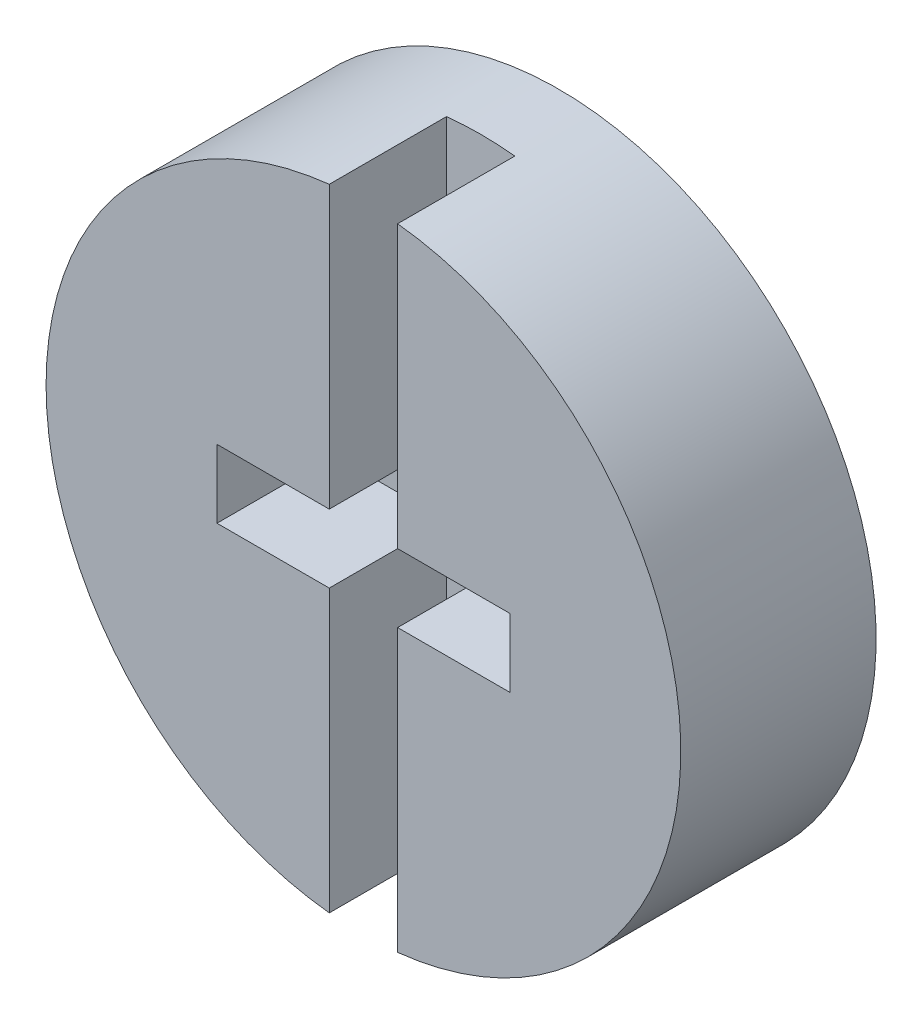
ISO-10303-21;
HEADER;
FILE_DESCRIPTION(('STEP AP214'),'2;1');
FILE_NAME('part.step','',(''),(''),'','','');
FILE_SCHEMA(('AUTOMOTIVE_DESIGN { 1 0 10303 214 1 1 1 1 }'));
ENDSEC;
DATA;
#1=APPLICATION_CONTEXT('core data for automotive mechanical design processes');
#2=APPLICATION_PROTOCOL_DEFINITION('international standard','automotive_design',2000,#1);
#3=PRODUCT_CONTEXT('',#1,'mechanical');
#4=PRODUCT('Part','Part','',(#3));
#5=PRODUCT_RELATED_PRODUCT_CATEGORY('part','',(#4));
#6=PRODUCT_DEFINITION_FORMATION('','',#4);
#7=PRODUCT_DEFINITION_CONTEXT('part definition',#1,'design');
#8=PRODUCT_DEFINITION('design','',#6,#7);
#9=PRODUCT_DEFINITION_SHAPE('','',#8);
#10=(LENGTH_UNIT() NAMED_UNIT(*) SI_UNIT(.MILLI.,.METRE.));
#11=(NAMED_UNIT(*) PLANE_ANGLE_UNIT() SI_UNIT($,.RADIAN.));
#12=(NAMED_UNIT(*) SI_UNIT($,.STERADIAN.) SOLID_ANGLE_UNIT());
#13=UNCERTAINTY_MEASURE_WITH_UNIT(LENGTH_MEASURE(1.E-05),#10,'distance_accuracy_value','');
#14=(GEOMETRIC_REPRESENTATION_CONTEXT(3) GLOBAL_UNCERTAINTY_ASSIGNED_CONTEXT((#13)) GLOBAL_UNIT_ASSIGNED_CONTEXT((#10,
#11,#12)) REPRESENTATION_CONTEXT('',''));
#15=CARTESIAN_POINT('',(0.,0.,0.));
#16=DIRECTION('',(0.,0.,1.));
#17=DIRECTION('',(1.,0.,0.));
#18=AXIS2_PLACEMENT_3D('',#15,#16,#17);
#19=CARTESIAN_POINT('',(6.83,76.6,-25.09841350948));
#20=DIRECTION('',(0.,0.,1.));
#21=DIRECTION('',(1.,0.,0.));
#22=AXIS2_PLACEMENT_3D('',#19,#20,#21);
#23=PLANE('',#22);
#24=DIRECTION('',(0.,1.,0.));
#25=VECTOR('',#24,1.);
#26=CARTESIAN_POINT('',(7.18,76.95,-25.09841350948));
#27=LINE('',#26,#25);
#28=CARTESIAN_POINT('',(7.18,76.95,-25.09841350948));
#29=VERTEX_POINT('',#28);
#30=CARTESIAN_POINT('',(7.18,79.8310988842809,-25.09841350948));
#31=VERTEX_POINT('',#30);
#32=EDGE_CURVE('E169',#29,#31,#27,.T.);
#33=ORIENTED_EDGE('',*,*,#32,.T.);
#34=CARTESIAN_POINT('',(6.83,76.6,-25.09841350948));
#35=DIRECTION('',(0.,0.,-1.));
#36=DIRECTION('',(-1.,0.,0.));
#37=AXIS2_PLACEMENT_3D('',#34,#35,#36);
#38=CIRCLE('',#37,3.25);
#39=CARTESIAN_POINT('',(6.48,79.8310988842809,-25.09841350948));
#40=VERTEX_POINT('',#39);
#41=EDGE_CURVE('E85',#31,#40,#38,.F.);
#42=ORIENTED_EDGE('',*,*,#41,.T.);
#43=DIRECTION('',(0.,1.,0.));
#44=VECTOR('',#43,1.);
#45=CARTESIAN_POINT('',(6.48,80.764650726676,-25.09841350948));
#46=LINE('',#45,#44);
#47=CARTESIAN_POINT('',(6.48,76.95,-25.09841350948));
#48=VERTEX_POINT('',#47);
#49=EDGE_CURVE('E91',#40,#48,#46,.F.);
#50=ORIENTED_EDGE('',*,*,#49,.T.);
#51=DIRECTION('',(1.,0.,0.));
#52=VECTOR('',#51,1.);
#53=CARTESIAN_POINT('',(6.48,76.95,-25.09841350948));
#54=LINE('',#53,#52);
#55=CARTESIAN_POINT('',(5.33,76.95,-25.09841350948));
#56=VERTEX_POINT('',#55);
#57=EDGE_CURVE('E71',#48,#56,#54,.F.);
#58=ORIENTED_EDGE('',*,*,#57,.T.);
#59=DIRECTION('',(0.,1.,0.));
#60=VECTOR('',#59,1.);
#61=CARTESIAN_POINT('',(5.33,76.95,-25.09841350948));
#62=LINE('',#61,#60);
#63=CARTESIAN_POINT('',(5.33,76.25,-25.09841350948));
#64=VERTEX_POINT('',#63);
#65=EDGE_CURVE('E196',#56,#64,#62,.F.);
#66=ORIENTED_EDGE('',*,*,#65,.T.);
#67=DIRECTION('',(1.,0.,0.));
#68=VECTOR('',#67,1.);
#69=CARTESIAN_POINT('',(5.33,76.25,-25.09841350948));
#70=LINE('',#69,#68);
#71=CARTESIAN_POINT('',(6.48,76.25,-25.09841350948));
#72=VERTEX_POINT('',#71);
#73=EDGE_CURVE('E172',#64,#72,#70,.T.);
#74=ORIENTED_EDGE('',*,*,#73,.T.);
#75=DIRECTION('',(0.,1.,0.));
#76=VECTOR('',#75,1.);
#77=CARTESIAN_POINT('',(6.48,76.25,-25.09841350948));
#78=LINE('',#77,#76);
#79=CARTESIAN_POINT('',(6.48,73.3689011157191,-25.09841350948));
#80=VERTEX_POINT('',#79);
#81=EDGE_CURVE('E95',#72,#80,#78,.F.);
#82=ORIENTED_EDGE('',*,*,#81,.T.);
#83=CARTESIAN_POINT('',(6.83,76.6,-25.09841350948));
#84=DIRECTION('',(0.,0.,-1.));
#85=DIRECTION('',(-1.,0.,0.));
#86=AXIS2_PLACEMENT_3D('',#83,#84,#85);
#87=CIRCLE('',#86,3.25);
#88=CARTESIAN_POINT('',(7.18,73.3689011157191,-25.09841350948));
#89=VERTEX_POINT('',#88);
#90=EDGE_CURVE('E20',#80,#89,#87,.F.);
#91=ORIENTED_EDGE('',*,*,#90,.T.);
#92=DIRECTION('',(0.,1.,0.));
#93=VECTOR('',#92,1.);
#94=CARTESIAN_POINT('',(7.18,73.083450539147,-25.09841350948));
#95=LINE('',#94,#93);
#96=CARTESIAN_POINT('',(7.18,76.25,-25.09841350948));
#97=VERTEX_POINT('',#96);
#98=EDGE_CURVE('E114',#89,#97,#95,.T.);
#99=ORIENTED_EDGE('',*,*,#98,.T.);
#100=DIRECTION('',(1.,0.,0.));
#101=VECTOR('',#100,1.);
#102=CARTESIAN_POINT('',(7.18,76.25,-25.09841350948));
#103=LINE('',#102,#101);
#104=CARTESIAN_POINT('',(8.33,76.25,-25.09841350948));
#105=VERTEX_POINT('',#104);
#106=EDGE_CURVE('E127',#97,#105,#103,.T.);
#107=ORIENTED_EDGE('',*,*,#106,.T.);
#108=DIRECTION('',(0.,1.,0.));
#109=VECTOR('',#108,1.);
#110=CARTESIAN_POINT('',(8.33,76.25,-25.09841350948));
#111=LINE('',#110,#109);
#112=CARTESIAN_POINT('',(8.33,76.95,-25.09841350948));
#113=VERTEX_POINT('',#112);
#114=EDGE_CURVE('E153',#105,#113,#111,.T.);
#115=ORIENTED_EDGE('',*,*,#114,.T.);
#116=DIRECTION('',(1.,0.,0.));
#117=VECTOR('',#116,1.);
#118=CARTESIAN_POINT('',(8.33,76.95,-25.09841350948));
#119=LINE('',#118,#117);
#120=EDGE_CURVE('E164',#113,#29,#119,.F.);
#121=ORIENTED_EDGE('',*,*,#120,.T.);
#122=EDGE_LOOP('',(#33,#42,#50,#58,#66,#74,#82,#91,#99,#107,#115,#121));
#123=FACE_BOUND('',#122,.T.);
#124=ADVANCED_FACE('F17',(#123),#23,.T.);
#125=CARTESIAN_POINT('',(6.48,76.95,-23.89841350948));
#126=DIRECTION('',(0.,1.,0.));
#127=DIRECTION('',(0.,0.,1.));
#128=AXIS2_PLACEMENT_3D('',#125,#126,#127);
#129=PLANE('',#128);
#130=ORIENTED_EDGE('',*,*,#57,.F.);
#131=DIRECTION('',(0.,0.,1.));
#132=VECTOR('',#131,1.);
#133=CARTESIAN_POINT('',(6.48,76.95,-23.89841350948));
#134=LINE('',#133,#132);
#135=CARTESIAN_POINT('',(6.48,76.95,-23.89841350948));
#136=VERTEX_POINT('',#135);
#137=EDGE_CURVE('E76',#48,#136,#134,.T.);
#138=ORIENTED_EDGE('',*,*,#137,.T.);
#139=DIRECTION('',(1.,0.,0.));
#140=VECTOR('',#139,1.);
#141=CARTESIAN_POINT('',(6.83,76.95,-23.89841350948));
#142=LINE('',#141,#140);
#143=CARTESIAN_POINT('',(5.33,76.95,-23.89841350948));
#144=VERTEX_POINT('',#143);
#145=EDGE_CURVE('E134',#144,#136,#142,.T.);
#146=ORIENTED_EDGE('',*,*,#145,.F.);
#147=DIRECTION('',(0.,0.,1.));
#148=VECTOR('',#147,1.);
#149=CARTESIAN_POINT('',(5.33,76.95,-23.89841350948));
#150=LINE('',#149,#148);
#151=EDGE_CURVE('E79',#144,#56,#150,.F.);
#152=ORIENTED_EDGE('',*,*,#151,.T.);
#153=EDGE_LOOP('',(#130,#138,#146,#152));
#154=FACE_BOUND('',#153,.T.);
#155=ADVANCED_FACE('F73',(#154),#129,.F.);
#156=CARTESIAN_POINT('',(6.48,80.764650726676,-23.89841350948));
#157=DIRECTION('',(-1.,0.,0.));
#158=DIRECTION('',(0.,0.,1.));
#159=AXIS2_PLACEMENT_3D('',#156,#157,#158);
#160=PLANE('',#159);
#161=ORIENTED_EDGE('',*,*,#49,.F.);
#162=DIRECTION('',(0.,0.,1.));
#163=VECTOR('',#162,1.);
#164=CARTESIAN_POINT('',(6.48,79.831098884281,-23.89841350948));
#165=LINE('',#164,#163);
#166=CARTESIAN_POINT('',(6.48,79.8310988842809,-23.89841350948));
#167=VERTEX_POINT('',#166);
#168=EDGE_CURVE('E84',#167,#40,#165,.F.);
#169=ORIENTED_EDGE('',*,*,#168,.F.);
#170=DIRECTION('',(0.,1.,0.));
#171=VECTOR('',#170,1.);
#172=CARTESIAN_POINT('',(6.48,76.6,-23.89841350948));
#173=LINE('',#172,#171);
#174=EDGE_CURVE('E94',#136,#167,#173,.T.);
#175=ORIENTED_EDGE('',*,*,#174,.F.);
#176=ORIENTED_EDGE('',*,*,#137,.F.);
#177=EDGE_LOOP('',(#161,#169,#175,#176));
#178=FACE_BOUND('',#177,.T.);
#179=ADVANCED_FACE('F89',(#178),#160,.F.);
#180=CARTESIAN_POINT('',(6.48,76.25,-23.89841350948));
#181=DIRECTION('',(-1.,0.,0.));
#182=DIRECTION('',(0.,0.,1.));
#183=AXIS2_PLACEMENT_3D('',#180,#181,#182);
#184=PLANE('',#183);
#185=ORIENTED_EDGE('',*,*,#81,.F.);
#186=DIRECTION('',(0.,0.,-1.));
#187=VECTOR('',#186,1.);
#188=CARTESIAN_POINT('',(6.48,76.25,-23.89841350948));
#189=LINE('',#188,#187);
#190=CARTESIAN_POINT('',(6.48,76.25,-23.89841350948));
#191=VERTEX_POINT('',#190);
#192=EDGE_CURVE('E173',#72,#191,#189,.F.);
#193=ORIENTED_EDGE('',*,*,#192,.T.);
#194=DIRECTION('',(0.,1.,0.));
#195=VECTOR('',#194,1.);
#196=CARTESIAN_POINT('',(6.48,76.6,-23.89841350948));
#197=LINE('',#196,#195);
#198=CARTESIAN_POINT('',(6.48,73.3689011157191,-23.89841350948));
#199=VERTEX_POINT('',#198);
#200=EDGE_CURVE('E182',#199,#191,#197,.T.);
#201=ORIENTED_EDGE('',*,*,#200,.F.);
#202=DIRECTION('',(0.,0.,1.));
#203=VECTOR('',#202,1.);
#204=CARTESIAN_POINT('',(6.48,73.368901115719,-23.89841350948));
#205=LINE('',#204,#203);
#206=EDGE_CURVE('E170',#80,#199,#205,.T.);
#207=ORIENTED_EDGE('',*,*,#206,.F.);
#208=EDGE_LOOP('',(#185,#193,#201,#207));
#209=FACE_BOUND('',#208,.T.);
#210=ADVANCED_FACE('F256',(#209),#184,.F.);
#211=CARTESIAN_POINT('',(5.33,76.25,-23.89841350948));
#212=DIRECTION('',(0.,-1.,0.));
#213=DIRECTION('',(0.,0.,-1.));
#214=AXIS2_PLACEMENT_3D('',#211,#212,#213);
#215=PLANE('',#214);
#216=ORIENTED_EDGE('',*,*,#73,.F.);
#217=DIRECTION('',(0.,0.,1.));
#218=VECTOR('',#217,1.);
#219=CARTESIAN_POINT('',(5.33,76.25,-23.89841350948));
#220=LINE('',#219,#218);
#221=CARTESIAN_POINT('',(5.33,76.25,-23.89841350948));
#222=VERTEX_POINT('',#221);
#223=EDGE_CURVE('E213',#64,#222,#220,.T.);
#224=ORIENTED_EDGE('',*,*,#223,.T.);
#225=DIRECTION('',(1.,0.,0.));
#226=VECTOR('',#225,1.);
#227=CARTESIAN_POINT('',(6.83,76.25,-23.89841350948));
#228=LINE('',#227,#226);
#229=EDGE_CURVE('E178',#191,#222,#228,.F.);
#230=ORIENTED_EDGE('',*,*,#229,.F.);
#231=ORIENTED_EDGE('',*,*,#192,.F.);
#232=EDGE_LOOP('',(#216,#224,#230,#231));
#233=FACE_BOUND('',#232,.T.);
#234=ADVANCED_FACE('F233',(#233),#215,.F.);
#235=CARTESIAN_POINT('',(5.33,76.95,-23.89841350948));
#236=DIRECTION('',(-1.,0.,0.));
#237=DIRECTION('',(0.,0.,1.));
#238=AXIS2_PLACEMENT_3D('',#235,#236,#237);
#239=PLANE('',#238);
#240=ORIENTED_EDGE('',*,*,#65,.F.);
#241=ORIENTED_EDGE('',*,*,#151,.F.);
#242=DIRECTION('',(0.,1.,0.));
#243=VECTOR('',#242,1.);
#244=CARTESIAN_POINT('',(5.33,76.6,-23.89841350948));
#245=LINE('',#244,#243);
#246=EDGE_CURVE('E181',#222,#144,#245,.T.);
#247=ORIENTED_EDGE('',*,*,#246,.F.);
#248=ORIENTED_EDGE('',*,*,#223,.F.);
#249=EDGE_LOOP('',(#240,#241,#247,#248));
#250=FACE_BOUND('',#249,.T.);
#251=ADVANCED_FACE('F239',(#250),#239,.F.);
#252=CARTESIAN_POINT('',(7.18,76.95,-23.89841350948));
#253=DIRECTION('',(1.,0.,0.));
#254=DIRECTION('',(0.,0.,-1.));
#255=AXIS2_PLACEMENT_3D('',#252,#253,#254);
#256=PLANE('',#255);
#257=ORIENTED_EDGE('',*,*,#32,.F.);
#258=DIRECTION('',(0.,0.,1.));
#259=VECTOR('',#258,1.);
#260=CARTESIAN_POINT('',(7.18,76.95,-23.89841350948));
#261=LINE('',#260,#259);
#262=CARTESIAN_POINT('',(7.18,76.95,-23.89841350948));
#263=VERTEX_POINT('',#262);
#264=EDGE_CURVE('E161',#29,#263,#261,.T.);
#265=ORIENTED_EDGE('',*,*,#264,.T.);
#266=DIRECTION('',(0.,1.,0.));
#267=VECTOR('',#266,1.);
#268=CARTESIAN_POINT('',(7.18,76.6,-23.89841350948));
#269=LINE('',#268,#267);
#270=CARTESIAN_POINT('',(7.18,79.8310988842809,-23.89841350948));
#271=VERTEX_POINT('',#270);
#272=EDGE_CURVE('E158',#271,#263,#269,.F.);
#273=ORIENTED_EDGE('',*,*,#272,.F.);
#274=DIRECTION('',(0.,0.,-1.));
#275=VECTOR('',#274,1.);
#276=CARTESIAN_POINT('',(7.18,79.831098884281,-23.89841350948));
#277=LINE('',#276,#275);
#278=EDGE_CURVE('E167',#31,#271,#277,.F.);
#279=ORIENTED_EDGE('',*,*,#278,.F.);
#280=EDGE_LOOP('',(#257,#265,#273,#279));
#281=FACE_BOUND('',#280,.T.);
#282=ADVANCED_FACE('F285',(#281),#256,.F.);
#283=CARTESIAN_POINT('',(8.33,76.95,-23.89841350948));
#284=DIRECTION('',(0.,1.,0.));
#285=DIRECTION('',(0.,0.,1.));
#286=AXIS2_PLACEMENT_3D('',#283,#284,#285);
#287=PLANE('',#286);
#288=ORIENTED_EDGE('',*,*,#120,.F.);
#289=DIRECTION('',(0.,0.,-1.));
#290=VECTOR('',#289,1.);
#291=CARTESIAN_POINT('',(8.33,76.95,-23.89841350948));
#292=LINE('',#291,#290);
#293=CARTESIAN_POINT('',(8.33,76.95,-23.89841350948));
#294=VERTEX_POINT('',#293);
#295=EDGE_CURVE('E150',#113,#294,#292,.F.);
#296=ORIENTED_EDGE('',*,*,#295,.T.);
#297=DIRECTION('',(1.,0.,0.));
#298=VECTOR('',#297,1.);
#299=CARTESIAN_POINT('',(6.83,76.95,-23.89841350948));
#300=LINE('',#299,#298);
#301=EDGE_CURVE('E147',#263,#294,#300,.T.);
#302=ORIENTED_EDGE('',*,*,#301,.F.);
#303=ORIENTED_EDGE('',*,*,#264,.F.);
#304=EDGE_LOOP('',(#288,#296,#302,#303));
#305=FACE_BOUND('',#304,.T.);
#306=ADVANCED_FACE('F288',(#305),#287,.F.);
#307=CARTESIAN_POINT('',(8.33,76.25,-23.89841350948));
#308=DIRECTION('',(1.,0.,0.));
#309=DIRECTION('',(0.,0.,-1.));
#310=AXIS2_PLACEMENT_3D('',#307,#308,#309);
#311=PLANE('',#310);
#312=ORIENTED_EDGE('',*,*,#114,.F.);
#313=DIRECTION('',(0.,0.,-1.));
#314=VECTOR('',#313,1.);
#315=CARTESIAN_POINT('',(8.33,76.25,-23.89841350948));
#316=LINE('',#315,#314);
#317=CARTESIAN_POINT('',(8.33,76.25,-23.89841350948));
#318=VERTEX_POINT('',#317);
#319=EDGE_CURVE('E124',#105,#318,#316,.F.);
#320=ORIENTED_EDGE('',*,*,#319,.T.);
#321=DIRECTION('',(0.,1.,0.));
#322=VECTOR('',#321,1.);
#323=CARTESIAN_POINT('',(8.33,76.6,-23.89841350948));
#324=LINE('',#323,#322);
#325=EDGE_CURVE('E140',#294,#318,#324,.F.);
#326=ORIENTED_EDGE('',*,*,#325,.F.);
#327=ORIENTED_EDGE('',*,*,#295,.F.);
#328=EDGE_LOOP('',(#312,#320,#326,#327));
#329=FACE_BOUND('',#328,.T.);
#330=ADVANCED_FACE('F291',(#329),#311,.F.);
#331=CARTESIAN_POINT('',(7.18,76.25,-23.89841350948));
#332=DIRECTION('',(0.,-1.,0.));
#333=DIRECTION('',(0.,0.,-1.));
#334=AXIS2_PLACEMENT_3D('',#331,#332,#333);
#335=PLANE('',#334);
#336=ORIENTED_EDGE('',*,*,#106,.F.);
#337=DIRECTION('',(0.,0.,-1.));
#338=VECTOR('',#337,1.);
#339=CARTESIAN_POINT('',(7.18,76.25,-23.89841350948));
#340=LINE('',#339,#338);
#341=CARTESIAN_POINT('',(7.18,76.25,-23.89841350948));
#342=VERTEX_POINT('',#341);
#343=EDGE_CURVE('E120',#97,#342,#340,.F.);
#344=ORIENTED_EDGE('',*,*,#343,.T.);
#345=DIRECTION('',(1.,0.,0.));
#346=VECTOR('',#345,1.);
#347=CARTESIAN_POINT('',(6.83,76.25,-23.89841350948));
#348=LINE('',#347,#346);
#349=EDGE_CURVE('E137',#318,#342,#348,.F.);
#350=ORIENTED_EDGE('',*,*,#349,.F.);
#351=ORIENTED_EDGE('',*,*,#319,.F.);
#352=EDGE_LOOP('',(#336,#344,#350,#351));
#353=FACE_BOUND('',#352,.T.);
#354=ADVANCED_FACE('F294',(#353),#335,.F.);
#355=CARTESIAN_POINT('',(7.18,73.083450539147,-23.89841350948));
#356=DIRECTION('',(1.,0.,0.));
#357=DIRECTION('',(0.,0.,-1.));
#358=AXIS2_PLACEMENT_3D('',#355,#356,#357);
#359=PLANE('',#358);
#360=ORIENTED_EDGE('',*,*,#98,.F.);
#361=DIRECTION('',(0.,0.,-1.));
#362=VECTOR('',#361,1.);
#363=CARTESIAN_POINT('',(7.18,73.368901115719,-23.89841350948));
#364=LINE('',#363,#362);
#365=CARTESIAN_POINT('',(7.18,73.3689011157191,-23.89841350948));
#366=VERTEX_POINT('',#365);
#367=EDGE_CURVE('E35',#366,#89,#364,.T.);
#368=ORIENTED_EDGE('',*,*,#367,.F.);
#369=DIRECTION('',(0.,1.,0.));
#370=VECTOR('',#369,1.);
#371=CARTESIAN_POINT('',(7.18,76.6,-23.89841350948));
#372=LINE('',#371,#370);
#373=EDGE_CURVE('E109',#342,#366,#372,.F.);
#374=ORIENTED_EDGE('',*,*,#373,.F.);
#375=ORIENTED_EDGE('',*,*,#343,.F.);
#376=EDGE_LOOP('',(#360,#368,#374,#375));
#377=FACE_BOUND('',#376,.T.);
#378=ADVANCED_FACE('F118',(#377),#359,.F.);
#379=CARTESIAN_POINT('',(6.83,76.6,-23.89841350948));
#380=DIRECTION('',(0.,0.,1.));
#381=DIRECTION('',(1.,0.,0.));
#382=AXIS2_PLACEMENT_3D('',#379,#380,#381);
#383=PLANE('',#382);
#384=ORIENTED_EDGE('',*,*,#229,.T.);
#385=ORIENTED_EDGE('',*,*,#246,.T.);
#386=ORIENTED_EDGE('',*,*,#145,.T.);
#387=ORIENTED_EDGE('',*,*,#174,.T.);
#388=CARTESIAN_POINT('',(6.83,76.6,-23.89841350948));
#389=DIRECTION('',(0.,0.,-1.));
#390=DIRECTION('',(-1.,0.,0.));
#391=AXIS2_PLACEMENT_3D('',#388,#389,#390);
#392=CIRCLE('',#391,3.25);
#393=EDGE_CURVE('E108',#199,#167,#392,.T.);
#394=ORIENTED_EDGE('',*,*,#393,.F.);
#395=ORIENTED_EDGE('',*,*,#200,.T.);
#396=EDGE_LOOP('',(#384,#385,#386,#387,#394,#395));
#397=FACE_BOUND('',#396,.T.);
#398=ADVANCED_FACE('F242',(#397),#383,.T.);
#399=CARTESIAN_POINT('',(6.83,76.6,-23.89841350948));
#400=DIRECTION('',(0.,0.,1.));
#401=DIRECTION('',(1.,0.,0.));
#402=AXIS2_PLACEMENT_3D('',#399,#400,#401);
#403=PLANE('',#402);
#404=ORIENTED_EDGE('',*,*,#349,.T.);
#405=ORIENTED_EDGE('',*,*,#373,.T.);
#406=CARTESIAN_POINT('',(6.83,76.6,-23.89841350948));
#407=DIRECTION('',(0.,0.,-1.));
#408=DIRECTION('',(-1.,0.,0.));
#409=AXIS2_PLACEMENT_3D('',#406,#407,#408);
#410=CIRCLE('',#409,3.25);
#411=EDGE_CURVE('E26',#271,#366,#410,.T.);
#412=ORIENTED_EDGE('',*,*,#411,.F.);
#413=ORIENTED_EDGE('',*,*,#272,.T.);
#414=ORIENTED_EDGE('',*,*,#301,.T.);
#415=ORIENTED_EDGE('',*,*,#325,.T.);
#416=EDGE_LOOP('',(#404,#405,#412,#413,#414,#415));
#417=FACE_BOUND('',#416,.T.);
#418=ADVANCED_FACE('F267',(#417),#403,.T.);
#419=CARTESIAN_POINT('',(6.83,76.6,-25.89841350948));
#420=DIRECTION('',(0.,0.,-1.));
#421=DIRECTION('',(-1.,0.,0.));
#422=AXIS2_PLACEMENT_3D('',#419,#420,#421);
#423=CYLINDRICAL_SURFACE('',#422,3.25);
#424=CARTESIAN_POINT('',(6.83,76.6,-25.89841350948));
#425=DIRECTION('',(0.,0.,-1.));
#426=DIRECTION('',(-1.,0.,0.));
#427=AXIS2_PLACEMENT_3D('',#424,#425,#426);
#428=CIRCLE('',#427,3.25);
#429=CARTESIAN_POINT('',(3.58,76.6,-25.89841350948));
#430=VERTEX_POINT('',#429);
#431=EDGE_CURVE('E11',#430,#430,#428,.F.);
#432=ORIENTED_EDGE('',*,*,#431,.T.);
#433=EDGE_LOOP('',(#432));
#434=FACE_BOUND('',#433,.T.);
#435=ORIENTED_EDGE('',*,*,#367,.T.);
#436=ORIENTED_EDGE('',*,*,#90,.F.);
#437=ORIENTED_EDGE('',*,*,#206,.T.);
#438=ORIENTED_EDGE('',*,*,#393,.T.);
#439=ORIENTED_EDGE('',*,*,#168,.T.);
#440=ORIENTED_EDGE('',*,*,#41,.F.);
#441=ORIENTED_EDGE('',*,*,#278,.T.);
#442=ORIENTED_EDGE('',*,*,#411,.T.);
#443=EDGE_LOOP('',(#435,#436,#437,#438,#439,#440,#441,#442));
#444=FACE_BOUND('',#443,.T.);
#445=ADVANCED_FACE('F122',(#434,#444),#423,.T.);
#446=CARTESIAN_POINT('',(6.83,76.6,-25.89841350948));
#447=DIRECTION('',(0.,0.,1.));
#448=DIRECTION('',(1.,0.,0.));
#449=AXIS2_PLACEMENT_3D('',#446,#447,#448);
#450=PLANE('',#449);
#451=ORIENTED_EDGE('',*,*,#431,.F.);
#452=EDGE_LOOP('',(#451));
#453=FACE_BOUND('',#452,.T.);
#454=ADVANCED_FACE('F304',(#453),#450,.F.);
#455=CLOSED_SHELL('',(#124,#155,#179,#210,#234,#251,#282,#306,#330,#354,#378,#398,#418,#445,#454));
#456=MANIFOLD_SOLID_BREP('B1',#455);
#457=ADVANCED_BREP_SHAPE_REPRESENTATION('',(#18,#456),#14);
#458=SHAPE_DEFINITION_REPRESENTATION(#9,#457);
ENDSEC;
END-ISO-10303-21;
